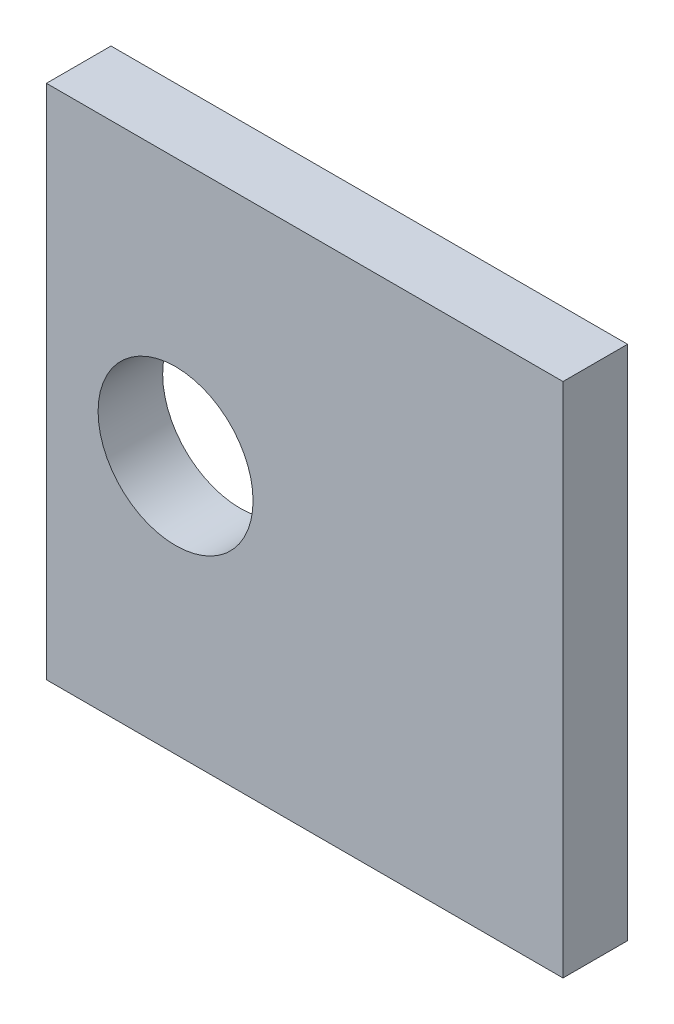
ISO-10303-21;
HEADER;
FILE_DESCRIPTION(('STEP AP214'),'2;1');
FILE_NAME('part.step','',(''),(''),'','','');
FILE_SCHEMA(('AUTOMOTIVE_DESIGN { 1 0 10303 214 1 1 1 1 }'));
ENDSEC;
DATA;
#1=APPLICATION_CONTEXT('core data for automotive mechanical design processes');
#2=APPLICATION_PROTOCOL_DEFINITION('international standard','automotive_design',2000,#1);
#3=PRODUCT_CONTEXT('',#1,'mechanical');
#4=PRODUCT('Part','Part','',(#3));
#5=PRODUCT_RELATED_PRODUCT_CATEGORY('part','',(#4));
#6=PRODUCT_DEFINITION_FORMATION('','',#4);
#7=PRODUCT_DEFINITION_CONTEXT('part definition',#1,'design');
#8=PRODUCT_DEFINITION('design','',#6,#7);
#9=PRODUCT_DEFINITION_SHAPE('','',#8);
#10=(LENGTH_UNIT() NAMED_UNIT(*) SI_UNIT(.MILLI.,.METRE.));
#11=(NAMED_UNIT(*) PLANE_ANGLE_UNIT() SI_UNIT($,.RADIAN.));
#12=(NAMED_UNIT(*) SI_UNIT($,.STERADIAN.) SOLID_ANGLE_UNIT());
#13=UNCERTAINTY_MEASURE_WITH_UNIT(LENGTH_MEASURE(1.E-05),#10,'distance_accuracy_value','');
#14=(GEOMETRIC_REPRESENTATION_CONTEXT(3) GLOBAL_UNCERTAINTY_ASSIGNED_CONTEXT((#13)) GLOBAL_UNIT_ASSIGNED_CONTEXT((#10,
#11,#12)) REPRESENTATION_CONTEXT('',''));
#15=CARTESIAN_POINT('',(0.,0.,0.));
#16=DIRECTION('',(0.,0.,1.));
#17=DIRECTION('',(1.,0.,0.));
#18=AXIS2_PLACEMENT_3D('',#15,#16,#17);
#19=CARTESIAN_POINT('',(0.,0.,5.));
#20=DIRECTION('',(0.,0.,-1.));
#21=DIRECTION('',(-1.,0.,0.));
#22=AXIS2_PLACEMENT_3D('',#19,#20,#21);
#23=PLANE('',#22);
#24=DIRECTION('',(0.,-1.,0.));
#25=VECTOR('',#24,1.);
#26=CARTESIAN_POINT('',(-20.,20.,5.));
#27=LINE('',#26,#25);
#28=CARTESIAN_POINT('',(-20.,20.,5.));
#29=VERTEX_POINT('',#28);
#30=CARTESIAN_POINT('',(-20.,-20.,5.));
#31=VERTEX_POINT('',#30);
#32=EDGE_CURVE('E92',#29,#31,#27,.T.);
#33=ORIENTED_EDGE('',*,*,#32,.T.);
#34=DIRECTION('',(1.,0.,0.));
#35=VECTOR('',#34,1.);
#36=CARTESIAN_POINT('',(20.,-20.,5.));
#37=LINE('',#36,#35);
#38=CARTESIAN_POINT('',(20.,-20.,5.));
#39=VERTEX_POINT('',#38);
#40=EDGE_CURVE('E87',#31,#39,#37,.T.);
#41=ORIENTED_EDGE('',*,*,#40,.T.);
#42=DIRECTION('',(0.,1.,0.));
#43=VECTOR('',#42,1.);
#44=CARTESIAN_POINT('',(20.,20.,5.));
#45=LINE('',#44,#43);
#46=CARTESIAN_POINT('',(20.,20.,5.));
#47=VERTEX_POINT('',#46);
#48=EDGE_CURVE('E90',#39,#47,#45,.T.);
#49=ORIENTED_EDGE('',*,*,#48,.T.);
#50=DIRECTION('',(-1.,0.,0.));
#51=VECTOR('',#50,1.);
#52=CARTESIAN_POINT('',(20.,20.,5.));
#53=LINE('',#52,#51);
#54=EDGE_CURVE('E57',#47,#29,#53,.T.);
#55=ORIENTED_EDGE('',*,*,#54,.T.);
#56=EDGE_LOOP('',(#33,#41,#49,#55));
#57=FACE_BOUND('',#56,.T.);
#58=CARTESIAN_POINT('',(-10.,0.,5.));
#59=DIRECTION('',(0.,0.,1.));
#60=DIRECTION('',(1.,0.,0.));
#61=AXIS2_PLACEMENT_3D('',#58,#59,#60);
#62=CIRCLE('',#61,6.);
#63=CARTESIAN_POINT('',(-4.,0.,5.));
#64=VERTEX_POINT('',#63);
#65=EDGE_CURVE('E112',#64,#64,#62,.T.);
#66=ORIENTED_EDGE('',*,*,#65,.F.);
#67=EDGE_LOOP('',(#66));
#68=FACE_BOUND('',#67,.T.);
#69=ADVANCED_FACE('F39',(#57,#68),#23,.F.);
#70=CARTESIAN_POINT('',(0.,0.,0.));
#71=DIRECTION('',(0.,0.,-1.));
#72=DIRECTION('',(-1.,0.,0.));
#73=AXIS2_PLACEMENT_3D('',#70,#71,#72);
#74=PLANE('',#73);
#75=DIRECTION('',(0.,-1.,0.));
#76=VECTOR('',#75,1.);
#77=CARTESIAN_POINT('',(-20.,20.,0.));
#78=LINE('',#77,#76);
#79=CARTESIAN_POINT('',(-20.,20.,0.));
#80=VERTEX_POINT('',#79);
#81=CARTESIAN_POINT('',(-20.,-20.,0.));
#82=VERTEX_POINT('',#81);
#83=EDGE_CURVE('E108',#80,#82,#78,.T.);
#84=ORIENTED_EDGE('',*,*,#83,.F.);
#85=DIRECTION('',(-1.,0.,0.));
#86=VECTOR('',#85,1.);
#87=CARTESIAN_POINT('',(20.,20.,0.));
#88=LINE('',#87,#86);
#89=CARTESIAN_POINT('',(20.,20.,0.));
#90=VERTEX_POINT('',#89);
#91=EDGE_CURVE('E80',#90,#80,#88,.T.);
#92=ORIENTED_EDGE('',*,*,#91,.F.);
#93=DIRECTION('',(0.,1.,0.));
#94=VECTOR('',#93,1.);
#95=CARTESIAN_POINT('',(20.,20.,0.));
#96=LINE('',#95,#94);
#97=CARTESIAN_POINT('',(20.,-20.,0.));
#98=VERTEX_POINT('',#97);
#99=EDGE_CURVE('E74',#98,#90,#96,.T.);
#100=ORIENTED_EDGE('',*,*,#99,.F.);
#101=DIRECTION('',(1.,0.,0.));
#102=VECTOR('',#101,1.);
#103=CARTESIAN_POINT('',(20.,-20.,0.));
#104=LINE('',#103,#102);
#105=EDGE_CURVE('E97',#82,#98,#104,.T.);
#106=ORIENTED_EDGE('',*,*,#105,.F.);
#107=EDGE_LOOP('',(#84,#92,#100,#106));
#108=FACE_BOUND('',#107,.T.);
#109=CARTESIAN_POINT('',(-10.,0.,0.));
#110=DIRECTION('',(0.,0.,1.));
#111=DIRECTION('',(1.,0.,0.));
#112=AXIS2_PLACEMENT_3D('',#109,#110,#111);
#113=CIRCLE('',#112,6.);
#114=CARTESIAN_POINT('',(-4.,0.,0.));
#115=VERTEX_POINT('',#114);
#116=EDGE_CURVE('E130',#115,#115,#113,.T.);
#117=ORIENTED_EDGE('',*,*,#116,.T.);
#118=EDGE_LOOP('',(#117));
#119=FACE_BOUND('',#118,.T.);
#120=ADVANCED_FACE('F125',(#108,#119),#74,.T.);
#121=CARTESIAN_POINT('',(-20.,20.,5.));
#122=DIRECTION('',(1.,0.,0.));
#123=DIRECTION('',(0.,0.,-1.));
#124=AXIS2_PLACEMENT_3D('',#121,#122,#123);
#125=PLANE('',#124);
#126=ORIENTED_EDGE('',*,*,#83,.T.);
#127=DIRECTION('',(0.,0.,-1.));
#128=VECTOR('',#127,1.);
#129=CARTESIAN_POINT('',(-20.,-20.,5.));
#130=LINE('',#129,#128);
#131=EDGE_CURVE('E11',#31,#82,#130,.T.);
#132=ORIENTED_EDGE('',*,*,#131,.F.);
#133=ORIENTED_EDGE('',*,*,#32,.F.);
#134=DIRECTION('',(0.,0.,-1.));
#135=VECTOR('',#134,1.);
#136=CARTESIAN_POINT('',(-20.,20.,5.));
#137=LINE('',#136,#135);
#138=EDGE_CURVE('E104',#29,#80,#137,.T.);
#139=ORIENTED_EDGE('',*,*,#138,.T.);
#140=EDGE_LOOP('',(#126,#132,#133,#139));
#141=FACE_BOUND('',#140,.T.);
#142=ADVANCED_FACE('F41',(#141),#125,.F.);
#143=CARTESIAN_POINT('',(20.,-20.,5.));
#144=DIRECTION('',(0.,1.,0.));
#145=DIRECTION('',(-1.,0.,0.));
#146=AXIS2_PLACEMENT_3D('',#143,#144,#145);
#147=PLANE('',#146);
#148=ORIENTED_EDGE('',*,*,#105,.T.);
#149=DIRECTION('',(0.,0.,-1.));
#150=VECTOR('',#149,1.);
#151=CARTESIAN_POINT('',(20.,-20.,5.));
#152=LINE('',#151,#150);
#153=EDGE_CURVE('E49',#39,#98,#152,.T.);
#154=ORIENTED_EDGE('',*,*,#153,.F.);
#155=ORIENTED_EDGE('',*,*,#40,.F.);
#156=ORIENTED_EDGE('',*,*,#131,.T.);
#157=EDGE_LOOP('',(#148,#154,#155,#156));
#158=FACE_BOUND('',#157,.T.);
#159=ADVANCED_FACE('F96',(#158),#147,.F.);
#160=CARTESIAN_POINT('',(20.,20.,5.));
#161=DIRECTION('',(-1.,0.,0.));
#162=DIRECTION('',(0.,-1.,0.));
#163=AXIS2_PLACEMENT_3D('',#160,#161,#162);
#164=PLANE('',#163);
#165=ORIENTED_EDGE('',*,*,#99,.T.);
#166=DIRECTION('',(0.,0.,-1.));
#167=VECTOR('',#166,1.);
#168=CARTESIAN_POINT('',(20.,20.,5.));
#169=LINE('',#168,#167);
#170=EDGE_CURVE('E99',#47,#90,#169,.T.);
#171=ORIENTED_EDGE('',*,*,#170,.F.);
#172=ORIENTED_EDGE('',*,*,#48,.F.);
#173=ORIENTED_EDGE('',*,*,#153,.T.);
#174=EDGE_LOOP('',(#165,#171,#172,#173));
#175=FACE_BOUND('',#174,.T.);
#176=ADVANCED_FACE('F100',(#175),#164,.F.);
#177=CARTESIAN_POINT('',(20.,20.,5.));
#178=DIRECTION('',(0.,-1.,0.));
#179=DIRECTION('',(1.,0.,0.));
#180=AXIS2_PLACEMENT_3D('',#177,#178,#179);
#181=PLANE('',#180);
#182=ORIENTED_EDGE('',*,*,#91,.T.);
#183=ORIENTED_EDGE('',*,*,#138,.F.);
#184=ORIENTED_EDGE('',*,*,#54,.F.);
#185=ORIENTED_EDGE('',*,*,#170,.T.);
#186=EDGE_LOOP('',(#182,#183,#184,#185));
#187=FACE_BOUND('',#186,.T.);
#188=ADVANCED_FACE('F122',(#187),#181,.F.);
#189=CARTESIAN_POINT('',(-10.,0.,5.));
#190=DIRECTION('',(0.,0.,-1.));
#191=DIRECTION('',(-1.,0.,0.));
#192=AXIS2_PLACEMENT_3D('',#189,#190,#191);
#193=CYLINDRICAL_SURFACE('',#192,6.);
#194=ORIENTED_EDGE('',*,*,#65,.T.);
#195=EDGE_LOOP('',(#194));
#196=FACE_BOUND('',#195,.T.);
#197=ORIENTED_EDGE('',*,*,#116,.F.);
#198=EDGE_LOOP('',(#197));
#199=FACE_BOUND('',#198,.T.);
#200=ADVANCED_FACE('F138',(#196,#199),#193,.F.);
#201=CLOSED_SHELL('',(#69,#120,#142,#159,#176,#188,#200));
#202=MANIFOLD_SOLID_BREP('B2',#201);
#203=ADVANCED_BREP_SHAPE_REPRESENTATION('',(#18,#202),#14);
#204=SHAPE_DEFINITION_REPRESENTATION(#9,#203);
ENDSEC;
END-ISO-10303-21;
